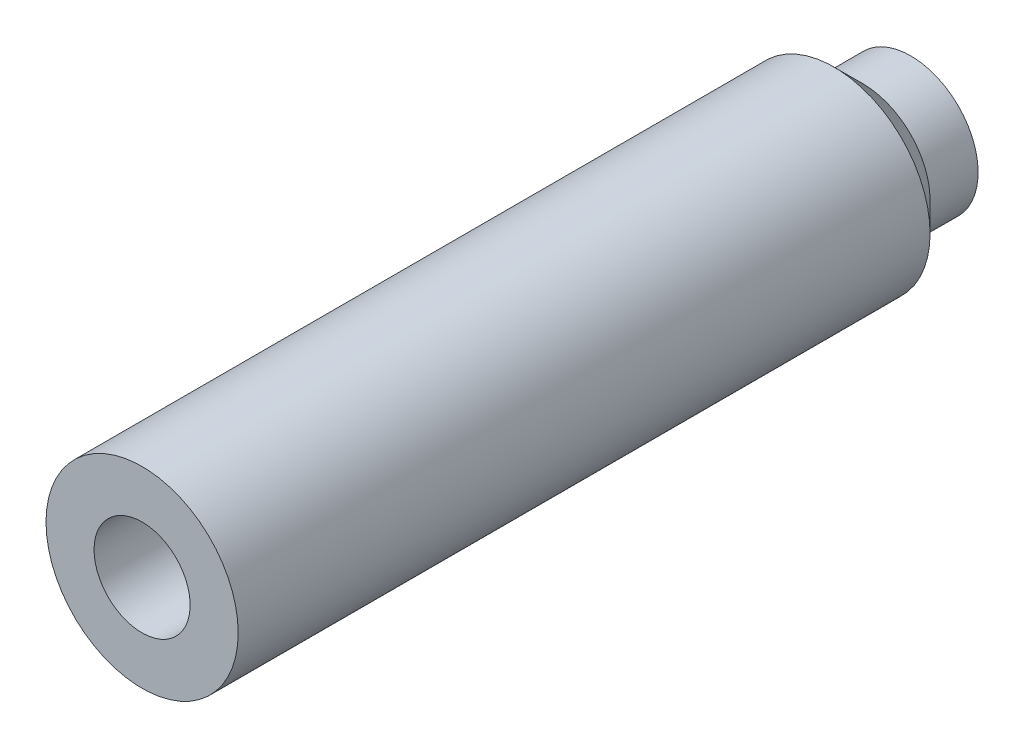
ISO-10303-21;
HEADER;
FILE_DESCRIPTION(('STEP AP214'),'2;1');
FILE_NAME('part.step','',(''),(''),'','','');
FILE_SCHEMA(('AUTOMOTIVE_DESIGN { 1 0 10303 214 1 1 1 1 }'));
ENDSEC;
DATA;
#1=APPLICATION_CONTEXT('core data for automotive mechanical design processes');
#2=APPLICATION_PROTOCOL_DEFINITION('international standard','automotive_design',2000,#1);
#3=PRODUCT_CONTEXT('',#1,'mechanical');
#4=PRODUCT('Part','Part','',(#3));
#5=PRODUCT_RELATED_PRODUCT_CATEGORY('part','',(#4));
#6=PRODUCT_DEFINITION_FORMATION('','',#4);
#7=PRODUCT_DEFINITION_CONTEXT('part definition',#1,'design');
#8=PRODUCT_DEFINITION('design','',#6,#7);
#9=PRODUCT_DEFINITION_SHAPE('','',#8);
#10=(LENGTH_UNIT() NAMED_UNIT(*) SI_UNIT(.MILLI.,.METRE.));
#11=(NAMED_UNIT(*) PLANE_ANGLE_UNIT() SI_UNIT($,.RADIAN.));
#12=(NAMED_UNIT(*) SI_UNIT($,.STERADIAN.) SOLID_ANGLE_UNIT());
#13=UNCERTAINTY_MEASURE_WITH_UNIT(LENGTH_MEASURE(1.E-05),#10,'distance_accuracy_value','');
#14=(GEOMETRIC_REPRESENTATION_CONTEXT(3) GLOBAL_UNCERTAINTY_ASSIGNED_CONTEXT((#13)) GLOBAL_UNIT_ASSIGNED_CONTEXT((#10,
#11,#12)) REPRESENTATION_CONTEXT('',''));
#15=CARTESIAN_POINT('',(0.,0.,0.));
#16=DIRECTION('',(0.,0.,1.));
#17=DIRECTION('',(1.,0.,0.));
#18=AXIS2_PLACEMENT_3D('',#15,#16,#17);
#19=CARTESIAN_POINT('',(0.,0.,50.8));
#20=DIRECTION('',(0.,0.,-1.));
#21=DIRECTION('',(-1.,0.,0.));
#22=AXIS2_PLACEMENT_3D('',#19,#20,#21);
#23=CYLINDRICAL_SURFACE('',#22,6.35);
#24=CARTESIAN_POINT('',(0.,0.,5.08));
#25=DIRECTION('',(0.,0.,-1.));
#26=DIRECTION('',(-1.,0.,0.));
#27=AXIS2_PLACEMENT_3D('',#24,#25,#26);
#28=CIRCLE('',#27,6.35);
#29=CARTESIAN_POINT('',(6.35,0.,5.08));
#30=VERTEX_POINT('',#29);
#31=EDGE_CURVE('E10',#30,#30,#28,.F.);
#32=ORIENTED_EDGE('',*,*,#31,.T.);
#33=EDGE_LOOP('',(#32));
#34=FACE_BOUND('',#33,.T.);
#35=CARTESIAN_POINT('',(0.,0.,50.8));
#36=DIRECTION('',(0.,0.,1.));
#37=DIRECTION('',(1.,0.,0.));
#38=AXIS2_PLACEMENT_3D('',#35,#36,#37);
#39=CIRCLE('',#38,6.35);
#40=CARTESIAN_POINT('',(6.35,0.,50.8));
#41=VERTEX_POINT('',#40);
#42=EDGE_CURVE('E48',#41,#41,#39,.T.);
#43=ORIENTED_EDGE('',*,*,#42,.F.);
#44=EDGE_LOOP('',(#43));
#45=FACE_BOUND('',#44,.T.);
#46=ADVANCED_FACE('F39',(#34,#45),#23,.T.);
#47=CARTESIAN_POINT('',(0.,0.,50.8));
#48=DIRECTION('',(0.,0.,1.));
#49=DIRECTION('',(1.,0.,0.));
#50=AXIS2_PLACEMENT_3D('',#47,#48,#49);
#51=PLANE('',#50);
#52=CARTESIAN_POINT('',(0.,0.,50.8));
#53=DIRECTION('',(0.,0.,-1.));
#54=DIRECTION('',(-1.,0.,0.));
#55=AXIS2_PLACEMENT_3D('',#52,#53,#54);
#56=CIRCLE('',#55,3.175);
#57=CARTESIAN_POINT('',(-3.175,0.,50.8));
#58=VERTEX_POINT('',#57);
#59=EDGE_CURVE('E63',#58,#58,#56,.T.);
#60=ORIENTED_EDGE('',*,*,#59,.T.);
#61=EDGE_LOOP('',(#60));
#62=FACE_BOUND('',#61,.T.);
#63=ORIENTED_EDGE('',*,*,#42,.T.);
#64=EDGE_LOOP('',(#63));
#65=FACE_BOUND('',#64,.T.);
#66=ADVANCED_FACE('F73',(#62,#65),#51,.T.);
#67=CARTESIAN_POINT('',(0.,0.,3.175));
#68=DIRECTION('',(0.,0.,-1.));
#69=DIRECTION('',(-1.,0.,0.));
#70=AXIS2_PLACEMENT_3D('',#67,#68,#69);
#71=CYLINDRICAL_SURFACE('',#70,4.445);
#72=CARTESIAN_POINT('',(0.,0.,3.175));
#73=DIRECTION('',(0.,0.,-1.));
#74=DIRECTION('',(-1.,0.,0.));
#75=AXIS2_PLACEMENT_3D('',#72,#73,#74);
#76=CIRCLE('',#75,4.445);
#77=CARTESIAN_POINT('',(4.44500000000001,0.,3.175));
#78=VERTEX_POINT('',#77);
#79=EDGE_CURVE('E53',#78,#78,#76,.T.);
#80=ORIENTED_EDGE('',*,*,#79,.T.);
#81=EDGE_LOOP('',(#80));
#82=FACE_BOUND('',#81,.T.);
#83=CARTESIAN_POINT('',(0.,0.,0.));
#84=DIRECTION('',(0.,0.,-1.));
#85=DIRECTION('',(-1.,0.,0.));
#86=AXIS2_PLACEMENT_3D('',#83,#84,#85);
#87=CIRCLE('',#86,4.445);
#88=CARTESIAN_POINT('',(-4.445,0.,0.));
#89=VERTEX_POINT('',#88);
#90=EDGE_CURVE('E58',#89,#89,#87,.T.);
#91=ORIENTED_EDGE('',*,*,#90,.F.);
#92=EDGE_LOOP('',(#91));
#93=FACE_BOUND('',#92,.T.);
#94=ADVANCED_FACE('F84',(#82,#93),#71,.T.);
#95=CARTESIAN_POINT('',(0.,0.,0.));
#96=DIRECTION('',(0.,0.,1.));
#97=DIRECTION('',(1.,0.,0.));
#98=AXIS2_PLACEMENT_3D('',#95,#96,#97);
#99=PLANE('',#98);
#100=CARTESIAN_POINT('',(0.,0.,0.));
#101=DIRECTION('',(0.,0.,-1.));
#102=DIRECTION('',(-1.,0.,0.));
#103=AXIS2_PLACEMENT_3D('',#100,#101,#102);
#104=CIRCLE('',#103,3.175);
#105=CARTESIAN_POINT('',(-3.175,0.,0.));
#106=VERTEX_POINT('',#105);
#107=EDGE_CURVE('E65',#106,#106,#104,.T.);
#108=ORIENTED_EDGE('',*,*,#107,.F.);
#109=EDGE_LOOP('',(#108));
#110=FACE_BOUND('',#109,.T.);
#111=ORIENTED_EDGE('',*,*,#90,.T.);
#112=EDGE_LOOP('',(#111));
#113=FACE_BOUND('',#112,.T.);
#114=ADVANCED_FACE('F81',(#110,#113),#99,.F.);
#115=CARTESIAN_POINT('',(0.,0.,3.175));
#116=DIRECTION('',(0.,0.,1.));
#117=DIRECTION('',(1.,0.,0.));
#118=AXIS2_PLACEMENT_3D('',#115,#116,#117);
#119=CONICAL_SURFACE('',#118,4.445,0.785398163397446);
#120=CARTESIAN_POINT('',(6.35,0.,5.08));
#121=CARTESIAN_POINT('',(6.33015625,0.,5.06015625));
#122=CARTESIAN_POINT('',(6.3103125,0.,5.0403125));
#123=CARTESIAN_POINT('',(6.270625,0.,5.000625));
#124=CARTESIAN_POINT('',(6.25078125,0.,4.98078125));
#125=CARTESIAN_POINT('',(6.21109375,0.,4.94109375));
#126=CARTESIAN_POINT('',(6.19125,0.,4.92125));
#127=CARTESIAN_POINT('',(6.1515625,0.,4.8815625));
#128=CARTESIAN_POINT('',(6.13171875,0.,4.86171875));
#129=CARTESIAN_POINT('',(6.09203125,0.,4.82203125));
#130=CARTESIAN_POINT('',(6.0721875,0.,4.8021875));
#131=CARTESIAN_POINT('',(6.0325,0.,4.7625));
#132=CARTESIAN_POINT('',(6.01265625,0.,4.74265625));
#133=CARTESIAN_POINT('',(5.97296875,0.,4.70296875));
#134=CARTESIAN_POINT('',(5.953125,0.,4.683125));
#135=CARTESIAN_POINT('',(5.9134375,0.,4.6434375));
#136=CARTESIAN_POINT('',(5.89359375,0.,4.62359375));
#137=CARTESIAN_POINT('',(5.85390625,0.,4.58390625));
#138=CARTESIAN_POINT('',(5.8340625,0.,4.5640625));
#139=CARTESIAN_POINT('',(5.794375,0.,4.524375));
#140=CARTESIAN_POINT('',(5.77453125,0.,4.50453125));
#141=CARTESIAN_POINT('',(5.73484375,0.,4.46484375));
#142=CARTESIAN_POINT('',(5.715,0.,4.445));
#143=CARTESIAN_POINT('',(5.6753125,0.,4.4053125));
#144=CARTESIAN_POINT('',(5.65546875,0.,4.38546875));
#145=CARTESIAN_POINT('',(5.61578125,0.,4.34578125));
#146=CARTESIAN_POINT('',(5.5959375,0.,4.3259375));
#147=CARTESIAN_POINT('',(5.55625,0.,4.28625));
#148=CARTESIAN_POINT('',(5.53640625,0.,4.26640625));
#149=CARTESIAN_POINT('',(5.49671875,0.,4.22671875));
#150=CARTESIAN_POINT('',(5.476875,0.,4.206875));
#151=CARTESIAN_POINT('',(5.4371875,0.,4.1671875));
#152=CARTESIAN_POINT('',(5.41734375,0.,4.14734375));
#153=CARTESIAN_POINT('',(5.37765625,0.,4.10765625));
#154=CARTESIAN_POINT('',(5.3578125,0.,4.0878125));
#155=CARTESIAN_POINT('',(5.318125,0.,4.048125));
#156=CARTESIAN_POINT('',(5.29828125,0.,4.02828125));
#157=CARTESIAN_POINT('',(5.25859375,0.,3.98859375));
#158=CARTESIAN_POINT('',(5.23875,0.,3.96875));
#159=CARTESIAN_POINT('',(5.1990625,0.,3.9290625));
#160=CARTESIAN_POINT('',(5.17921875,0.,3.90921875));
#161=CARTESIAN_POINT('',(5.13953125000001,0.,3.86953125));
#162=CARTESIAN_POINT('',(5.11968750000001,0.,3.8496875));
#163=CARTESIAN_POINT('',(5.08000000000001,0.,3.81));
#164=CARTESIAN_POINT('',(5.06015625,0.,3.79015625));
#165=CARTESIAN_POINT('',(5.02046875000001,0.,3.75046875));
#166=CARTESIAN_POINT('',(5.000625,0.,3.730625));
#167=CARTESIAN_POINT('',(4.96093750000001,0.,3.6909375));
#168=CARTESIAN_POINT('',(4.94109375000001,0.,3.67109375));
#169=CARTESIAN_POINT('',(4.90140625000001,0.,3.63140625));
#170=CARTESIAN_POINT('',(4.88156250000001,0.,3.6115625));
#171=CARTESIAN_POINT('',(4.84187500000001,0.,3.571875));
#172=CARTESIAN_POINT('',(4.82203125000001,0.,3.55203125));
#173=CARTESIAN_POINT('',(4.78234375000001,0.,3.51234375));
#174=CARTESIAN_POINT('',(4.76250000000001,0.,3.4925));
#175=CARTESIAN_POINT('',(4.72281250000001,0.,3.4528125));
#176=CARTESIAN_POINT('',(4.70296875000001,0.,3.43296875));
#177=CARTESIAN_POINT('',(4.66328125000001,0.,3.39328125));
#178=CARTESIAN_POINT('',(4.64343750000001,0.,3.3734375));
#179=CARTESIAN_POINT('',(4.60375000000001,0.,3.33375));
#180=CARTESIAN_POINT('',(4.58390625000001,0.,3.31390625));
#181=CARTESIAN_POINT('',(4.54421875000001,0.,3.27421875));
#182=CARTESIAN_POINT('',(4.52437500000001,0.,3.254375));
#183=CARTESIAN_POINT('',(4.48468750000001,0.,3.2146875));
#184=CARTESIAN_POINT('',(4.46484375000001,0.,3.19484375));
#185=CARTESIAN_POINT('',(4.44500000000001,0.,3.175));
#186=B_SPLINE_CURVE_WITH_KNOTS('',3,(#120,#121,#122,#123,#124,#125,#126,#127,#128,#129,#130,
#131,#132,#133,#134,#135,#136,#137,#138,#139,#140,#141,#142,#143,#144,#145,#146,#147,#148,#149,
#150,#151,#152,#153,#154,#155,#156,#157,#158,#159,#160,#161,#162,#163,#164,#165,#166,#167,#168,
#169,#170,#171,#172,#173,#174,#175,#176,#177,#178,#179,#180,#181,#182,#183,#184,#185),
.UNSPECIFIED.,.F.,.F.,(4,2,2,2,2,2,2,2,2,2,2,2,2,2,2,2,2,2,2,2,2,2,2,2,2,2,2,2,2,2,2,2,4),(0.,
0.0841899011350235,0.168379802270046,0.252569703405069,0.336759604540093,0.420949505675116,
0.50513940681014,0.589329307945162,0.673519209080186,0.757709110215209,0.841899011350232,
0.926088912485255,1.01027881362028,1.0944687147553,1.17865861589032,1.26284851702535,
1.34703841816037,1.43122831929539,1.51541822043042,1.59960812156544,1.68379802270046,
1.76798792383549,1.85217782497051,1.93636772610553,2.02055762724056,2.10474752837558,
2.1889374295106,2.27312733064563,2.35731723178065,2.44150713291567,2.5256970340507,
2.60988693518572,2.69407683632074),.UNSPECIFIED.);
#187=EDGE_CURVE('BSEAM42',#30,#78,#186,.T.);
#188=ORIENTED_EDGE('',*,*,#31,.F.);
#189=ORIENTED_EDGE('',*,*,#79,.F.);
#190=ORIENTED_EDGE('',*,*,#187,.T.);
#191=ORIENTED_EDGE('',*,*,#187,.F.);
#192=EDGE_LOOP('',(#188,#190,#189,#191));
#193=FACE_BOUND('',#192,.T.);
#194=ADVANCED_FACE('F42',(#193),#119,.T.);
#195=CARTESIAN_POINT('',(0.,0.,50.8));
#196=DIRECTION('',(0.,0.,-1.));
#197=DIRECTION('',(-1.,0.,0.));
#198=AXIS2_PLACEMENT_3D('',#195,#196,#197);
#199=CYLINDRICAL_SURFACE('',#198,3.175);
#200=ORIENTED_EDGE('',*,*,#59,.F.);
#201=EDGE_LOOP('',(#200));
#202=FACE_BOUND('',#201,.T.);
#203=ORIENTED_EDGE('',*,*,#107,.T.);
#204=EDGE_LOOP('',(#203));
#205=FACE_BOUND('',#204,.T.);
#206=ADVANCED_FACE('F75',(#202,#205),#199,.F.);
#207=CLOSED_SHELL('',(#46,#66,#94,#114,#194,#206));
#208=MANIFOLD_SOLID_BREP('B2',#207);
#209=ADVANCED_BREP_SHAPE_REPRESENTATION('',(#18,#208),#14);
#210=SHAPE_DEFINITION_REPRESENTATION(#9,#209);
ENDSEC;
END-ISO-10303-21;
